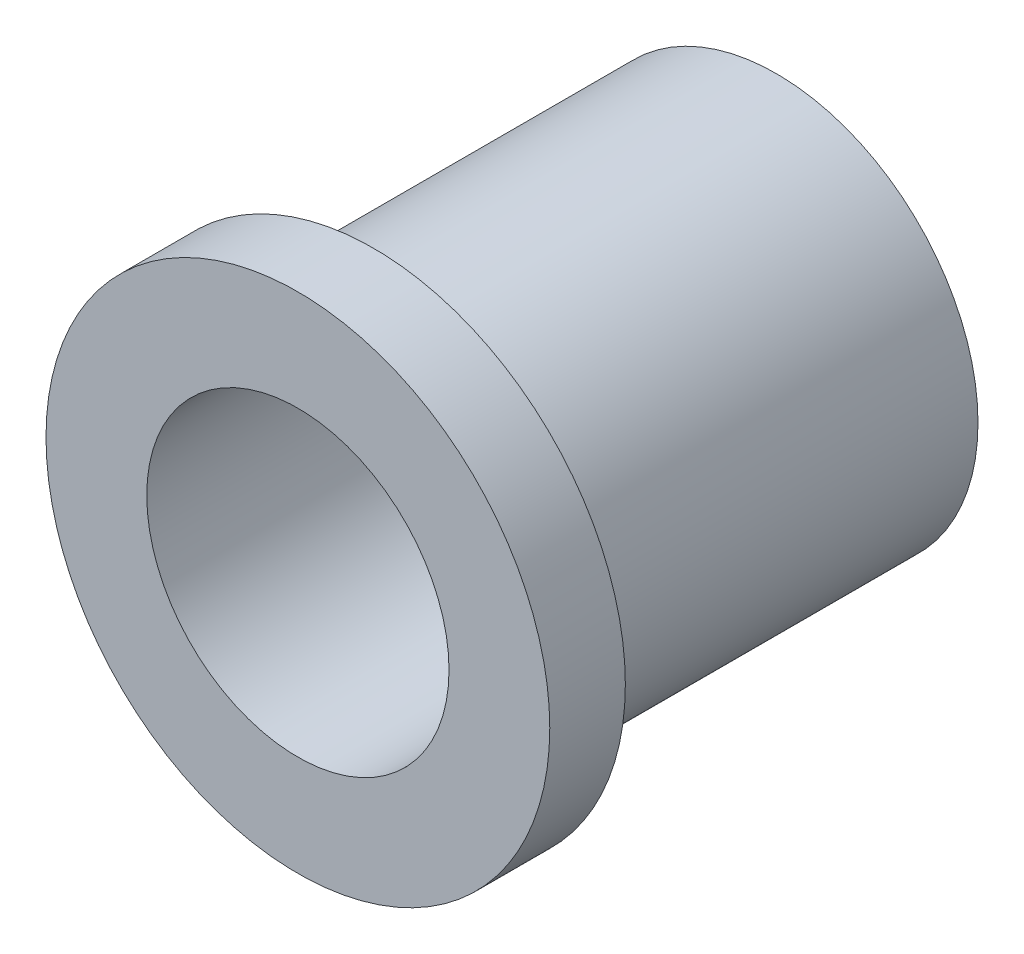
ISO-10303-21;
HEADER;
FILE_DESCRIPTION(('STEP AP214'),'2;1');
FILE_NAME('part.step','',(''),(''),'','','');
FILE_SCHEMA(('AUTOMOTIVE_DESIGN { 1 0 10303 214 1 1 1 1 }'));
ENDSEC;
DATA;
#1=APPLICATION_CONTEXT('core data for automotive mechanical design processes');
#2=APPLICATION_PROTOCOL_DEFINITION('international standard','automotive_design',2000,#1);
#3=PRODUCT_CONTEXT('',#1,'mechanical');
#4=PRODUCT('Part','Part','',(#3));
#5=PRODUCT_RELATED_PRODUCT_CATEGORY('part','',(#4));
#6=PRODUCT_DEFINITION_FORMATION('','',#4);
#7=PRODUCT_DEFINITION_CONTEXT('part definition',#1,'design');
#8=PRODUCT_DEFINITION('design','',#6,#7);
#9=PRODUCT_DEFINITION_SHAPE('','',#8);
#10=(LENGTH_UNIT() NAMED_UNIT(*) SI_UNIT(.MILLI.,.METRE.));
#11=(NAMED_UNIT(*) PLANE_ANGLE_UNIT() SI_UNIT($,.RADIAN.));
#12=(NAMED_UNIT(*) SI_UNIT($,.STERADIAN.) SOLID_ANGLE_UNIT());
#13=UNCERTAINTY_MEASURE_WITH_UNIT(LENGTH_MEASURE(1.E-05),#10,'distance_accuracy_value','');
#14=(GEOMETRIC_REPRESENTATION_CONTEXT(3) GLOBAL_UNCERTAINTY_ASSIGNED_CONTEXT((#13)) GLOBAL_UNIT_ASSIGNED_CONTEXT((#10,
#11,#12)) REPRESENTATION_CONTEXT('',''));
#15=CARTESIAN_POINT('',(0.,0.,0.));
#16=DIRECTION('',(0.,0.,1.));
#17=DIRECTION('',(1.,0.,0.));
#18=AXIS2_PLACEMENT_3D('',#15,#16,#17);
#19=CARTESIAN_POINT('',(0.,0.,-12.7));
#20=DIRECTION('',(0.,0.,1.));
#21=DIRECTION('',(1.,0.,0.));
#22=AXIS2_PLACEMENT_3D('',#19,#20,#21);
#23=PLANE('',#22);
#24=CARTESIAN_POINT('',(0.,0.,-12.7));
#25=DIRECTION('',(0.,0.,1.));
#26=DIRECTION('',(1.,0.,0.));
#27=AXIS2_PLACEMENT_3D('',#24,#25,#26);
#28=CIRCLE('',#27,12.7);
#29=CARTESIAN_POINT('',(12.7,0.,-12.7));
#30=VERTEX_POINT('',#29);
#31=EDGE_CURVE('E35',#30,#30,#28,.T.);
#32=ORIENTED_EDGE('',*,*,#31,.F.);
#33=EDGE_LOOP('',(#32));
#34=FACE_BOUND('',#33,.T.);
#35=CARTESIAN_POINT('',(0.,0.,-12.7));
#36=DIRECTION('',(0.,0.,1.));
#37=DIRECTION('',(1.,0.,0.));
#38=AXIS2_PLACEMENT_3D('',#35,#36,#37);
#39=CIRCLE('',#38,9.525);
#40=CARTESIAN_POINT('',(9.525,0.,-12.7));
#41=VERTEX_POINT('',#40);
#42=EDGE_CURVE('E42',#41,#41,#39,.T.);
#43=ORIENTED_EDGE('',*,*,#42,.T.);
#44=EDGE_LOOP('',(#43));
#45=FACE_BOUND('',#44,.T.);
#46=ADVANCED_FACE('F31',(#34,#45),#23,.F.);
#47=CARTESIAN_POINT('',(0.,0.,12.7));
#48=DIRECTION('',(0.,0.,-1.));
#49=DIRECTION('',(-1.,0.,0.));
#50=AXIS2_PLACEMENT_3D('',#47,#48,#49);
#51=CYLINDRICAL_SURFACE('',#50,12.7);
#52=CARTESIAN_POINT('',(0.,0.,12.7));
#53=DIRECTION('',(0.,0.,1.));
#54=DIRECTION('',(1.,0.,0.));
#55=AXIS2_PLACEMENT_3D('',#52,#53,#54);
#56=CIRCLE('',#55,12.7);
#57=CARTESIAN_POINT('',(12.7,0.,12.7));
#58=VERTEX_POINT('',#57);
#59=EDGE_CURVE('E10',#58,#58,#56,.T.);
#60=ORIENTED_EDGE('',*,*,#59,.F.);
#61=EDGE_LOOP('',(#60));
#62=FACE_BOUND('',#61,.T.);
#63=ORIENTED_EDGE('',*,*,#31,.T.);
#64=EDGE_LOOP('',(#63));
#65=FACE_BOUND('',#64,.T.);
#66=ADVANCED_FACE('F33',(#62,#65),#51,.T.);
#67=CARTESIAN_POINT('',(0.,0.,12.7));
#68=DIRECTION('',(0.,0.,-1.));
#69=DIRECTION('',(-1.,0.,0.));
#70=AXIS2_PLACEMENT_3D('',#67,#68,#69);
#71=CYLINDRICAL_SURFACE('',#70,9.525);
#72=ORIENTED_EDGE('',*,*,#42,.F.);
#73=EDGE_LOOP('',(#72));
#74=FACE_BOUND('',#73,.T.);
#75=CARTESIAN_POINT('',(0.,0.,17.4625));
#76=DIRECTION('',(0.,0.,1.));
#77=DIRECTION('',(1.,0.,0.));
#78=AXIS2_PLACEMENT_3D('',#75,#76,#77);
#79=CIRCLE('',#78,9.525);
#80=CARTESIAN_POINT('',(9.525,0.,17.4625));
#81=VERTEX_POINT('',#80);
#82=EDGE_CURVE('E50',#81,#81,#79,.T.);
#83=ORIENTED_EDGE('',*,*,#82,.T.);
#84=EDGE_LOOP('',(#83));
#85=FACE_BOUND('',#84,.T.);
#86=ADVANCED_FACE('F56',(#74,#85),#71,.F.);
#87=CARTESIAN_POINT('',(0.,0.,12.7));
#88=DIRECTION('',(0.,0.,1.));
#89=DIRECTION('',(1.,0.,0.));
#90=AXIS2_PLACEMENT_3D('',#87,#88,#89);
#91=PLANE('',#90);
#92=CARTESIAN_POINT('',(0.,0.,12.7));
#93=DIRECTION('',(0.,0.,1.));
#94=DIRECTION('',(1.,0.,0.));
#95=AXIS2_PLACEMENT_3D('',#92,#93,#94);
#96=CIRCLE('',#95,15.875);
#97=CARTESIAN_POINT('',(-15.875,0.,12.7));
#98=VERTEX_POINT('',#97);
#99=EDGE_CURVE('E47',#98,#98,#96,.T.);
#100=ORIENTED_EDGE('',*,*,#99,.F.);
#101=EDGE_LOOP('',(#100));
#102=FACE_BOUND('',#101,.T.);
#103=ORIENTED_EDGE('',*,*,#59,.T.);
#104=EDGE_LOOP('',(#103));
#105=FACE_BOUND('',#104,.T.);
#106=ADVANCED_FACE('F61',(#102,#105),#91,.F.);
#107=CARTESIAN_POINT('',(0.,0.,17.4625));
#108=DIRECTION('',(0.,0.,1.));
#109=DIRECTION('',(1.,0.,0.));
#110=AXIS2_PLACEMENT_3D('',#107,#108,#109);
#111=PLANE('',#110);
#112=CARTESIAN_POINT('',(0.,0.,17.4625));
#113=DIRECTION('',(0.,0.,1.));
#114=DIRECTION('',(1.,0.,0.));
#115=AXIS2_PLACEMENT_3D('',#112,#113,#114);
#116=CIRCLE('',#115,15.875);
#117=CARTESIAN_POINT('',(-15.875,0.,17.4625));
#118=VERTEX_POINT('',#117);
#119=EDGE_CURVE('E46',#118,#118,#116,.T.);
#120=ORIENTED_EDGE('',*,*,#119,.T.);
#121=EDGE_LOOP('',(#120));
#122=FACE_BOUND('',#121,.T.);
#123=ORIENTED_EDGE('',*,*,#82,.F.);
#124=EDGE_LOOP('',(#123));
#125=FACE_BOUND('',#124,.T.);
#126=ADVANCED_FACE('F58',(#122,#125),#111,.T.);
#127=CARTESIAN_POINT('',(0.,0.,17.4625));
#128=DIRECTION('',(0.,0.,-1.));
#129=DIRECTION('',(-1.,0.,0.));
#130=AXIS2_PLACEMENT_3D('',#127,#128,#129);
#131=CYLINDRICAL_SURFACE('',#130,15.875);
#132=CARTESIAN_POINT('',(-15.875,0.,17.4625));
#133=CARTESIAN_POINT('',(-15.875,0.,17.412890625));
#134=CARTESIAN_POINT('',(-15.875,0.,17.36328125));
#135=CARTESIAN_POINT('',(-15.875,0.,17.2640625));
#136=CARTESIAN_POINT('',(-15.875,0.,17.214453125));
#137=CARTESIAN_POINT('',(-15.875,0.,17.115234375));
#138=CARTESIAN_POINT('',(-15.875,0.,17.065625));
#139=CARTESIAN_POINT('',(-15.875,0.,16.96640625));
#140=CARTESIAN_POINT('',(-15.875,0.,16.916796875));
#141=CARTESIAN_POINT('',(-15.875,0.,16.817578125));
#142=CARTESIAN_POINT('',(-15.875,0.,16.76796875));
#143=CARTESIAN_POINT('',(-15.875,0.,16.66875));
#144=CARTESIAN_POINT('',(-15.875,0.,16.619140625));
#145=CARTESIAN_POINT('',(-15.875,0.,16.519921875));
#146=CARTESIAN_POINT('',(-15.875,0.,16.4703125));
#147=CARTESIAN_POINT('',(-15.875,0.,16.37109375));
#148=CARTESIAN_POINT('',(-15.875,0.,16.321484375));
#149=CARTESIAN_POINT('',(-15.875,0.,16.222265625));
#150=CARTESIAN_POINT('',(-15.875,0.,16.17265625));
#151=CARTESIAN_POINT('',(-15.875,0.,16.0734375));
#152=CARTESIAN_POINT('',(-15.875,0.,16.023828125));
#153=CARTESIAN_POINT('',(-15.875,0.,15.924609375));
#154=CARTESIAN_POINT('',(-15.875,0.,15.875));
#155=CARTESIAN_POINT('',(-15.875,0.,15.77578125));
#156=CARTESIAN_POINT('',(-15.875,0.,15.726171875));
#157=CARTESIAN_POINT('',(-15.875,0.,15.626953125));
#158=CARTESIAN_POINT('',(-15.875,0.,15.57734375));
#159=CARTESIAN_POINT('',(-15.875,0.,15.478125));
#160=CARTESIAN_POINT('',(-15.875,0.,15.428515625));
#161=CARTESIAN_POINT('',(-15.875,0.,15.329296875));
#162=CARTESIAN_POINT('',(-15.875,0.,15.2796875));
#163=CARTESIAN_POINT('',(-15.875,0.,15.18046875));
#164=CARTESIAN_POINT('',(-15.875,0.,15.130859375));
#165=CARTESIAN_POINT('',(-15.875,0.,15.031640625));
#166=CARTESIAN_POINT('',(-15.875,0.,14.98203125));
#167=CARTESIAN_POINT('',(-15.875,0.,14.8828125));
#168=CARTESIAN_POINT('',(-15.875,0.,14.833203125));
#169=CARTESIAN_POINT('',(-15.875,0.,14.733984375));
#170=CARTESIAN_POINT('',(-15.875,0.,14.684375));
#171=CARTESIAN_POINT('',(-15.875,0.,14.58515625));
#172=CARTESIAN_POINT('',(-15.875,0.,14.535546875));
#173=CARTESIAN_POINT('',(-15.875,0.,14.436328125));
#174=CARTESIAN_POINT('',(-15.875,0.,14.38671875));
#175=CARTESIAN_POINT('',(-15.875,0.,14.2875));
#176=CARTESIAN_POINT('',(-15.875,0.,14.237890625));
#177=CARTESIAN_POINT('',(-15.875,0.,14.138671875));
#178=CARTESIAN_POINT('',(-15.875,0.,14.0890625));
#179=CARTESIAN_POINT('',(-15.875,0.,13.98984375));
#180=CARTESIAN_POINT('',(-15.875,0.,13.940234375));
#181=CARTESIAN_POINT('',(-15.875,0.,13.841015625));
#182=CARTESIAN_POINT('',(-15.875,0.,13.79140625));
#183=CARTESIAN_POINT('',(-15.875,0.,13.6921875));
#184=CARTESIAN_POINT('',(-15.875,0.,13.642578125));
#185=CARTESIAN_POINT('',(-15.875,0.,13.543359375));
#186=CARTESIAN_POINT('',(-15.875,0.,13.49375));
#187=CARTESIAN_POINT('',(-15.875,0.,13.39453125));
#188=CARTESIAN_POINT('',(-15.875,0.,13.344921875));
#189=CARTESIAN_POINT('',(-15.875,0.,13.245703125));
#190=CARTESIAN_POINT('',(-15.875,0.,13.19609375));
#191=CARTESIAN_POINT('',(-15.875,0.,13.096875));
#192=CARTESIAN_POINT('',(-15.875,0.,13.047265625));
#193=CARTESIAN_POINT('',(-15.875,0.,12.948046875));
#194=CARTESIAN_POINT('',(-15.875,0.,12.8984375));
#195=CARTESIAN_POINT('',(-15.875,0.,12.79921875));
#196=CARTESIAN_POINT('',(-15.875,0.,12.749609375));
#197=CARTESIAN_POINT('',(-15.875,0.,12.7));
#198=B_SPLINE_CURVE_WITH_KNOTS('',3,(#132,#133,#134,#135,#136,#137,#138,#139,#140,#141,#142,
#143,#144,#145,#146,#147,#148,#149,#150,#151,#152,#153,#154,#155,#156,#157,#158,#159,#160,#161,
#162,#163,#164,#165,#166,#167,#168,#169,#170,#171,#172,#173,#174,#175,#176,#177,#178,#179,#180,
#181,#182,#183,#184,#185,#186,#187,#188,#189,#190,#191,#192,#193,#194,#195,#196,#197),
.UNSPECIFIED.,.F.,.F.,(4,2,2,2,2,2,2,2,2,2,2,2,2,2,2,2,2,2,2,2,2,2,2,2,2,2,2,2,2,2,2,2,4),(0.,
0.148828124999997,0.297656249999997,0.446484374999997,0.595312499999997,0.744140624999997,
0.892968749999997,1.041796875,1.190625,1.339453125,1.48828125,1.637109375,1.7859375,1.934765625,
2.08359375,2.232421875,2.38125,2.530078125,2.67890625,2.827734375,2.9765625,3.125390625,
3.27421875,3.423046875,3.571875,3.720703125,3.86953125,4.018359375,4.1671875,4.316015625,
4.46484375,4.613671875,4.7625),.UNSPECIFIED.);
#199=EDGE_CURVE('BSEAM60',#118,#98,#198,.T.);
#200=ORIENTED_EDGE('',*,*,#119,.F.);
#201=ORIENTED_EDGE('',*,*,#99,.T.);
#202=ORIENTED_EDGE('',*,*,#199,.T.);
#203=ORIENTED_EDGE('',*,*,#199,.F.);
#204=EDGE_LOOP('',(#200,#202,#201,#203));
#205=FACE_BOUND('',#204,.T.);
#206=ADVANCED_FACE('F60',(#205),#131,.T.);
#207=CLOSED_SHELL('',(#46,#66,#86,#106,#126,#206));
#208=MANIFOLD_SOLID_BREP('B2',#207);
#209=ADVANCED_BREP_SHAPE_REPRESENTATION('',(#18,#208),#14);
#210=SHAPE_DEFINITION_REPRESENTATION(#9,#209);
ENDSEC;
END-ISO-10303-21;
